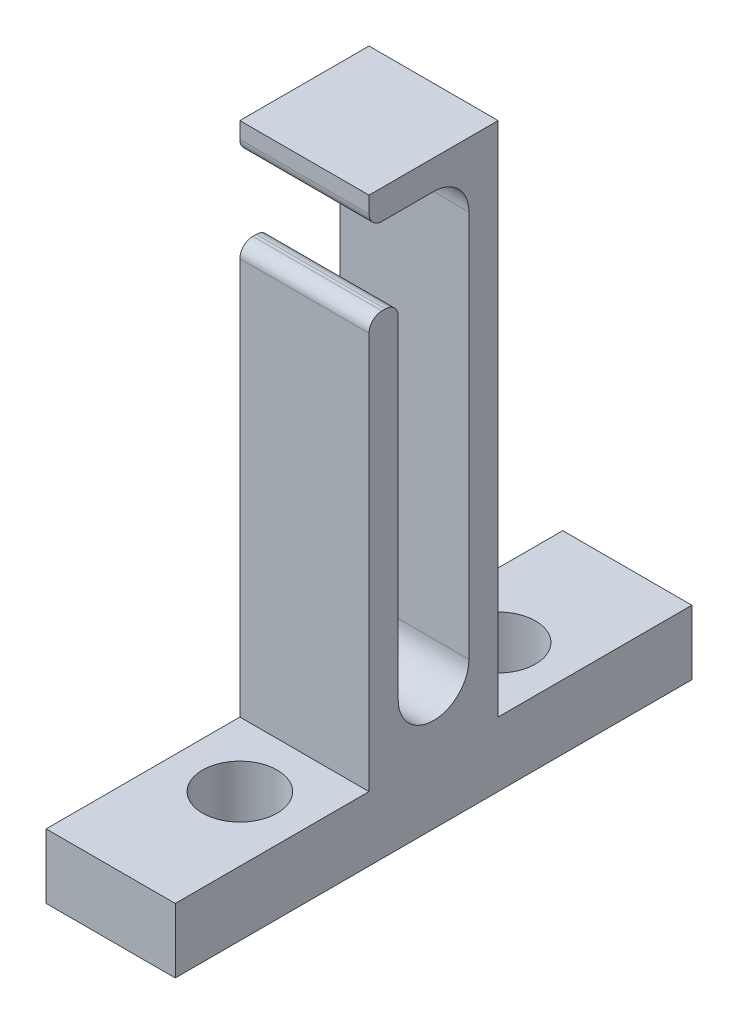
ISO-10303-21;
HEADER;
FILE_DESCRIPTION(('STEP AP214'),'2;1');
FILE_NAME('part.step','',(''),(''),'','','');
FILE_SCHEMA(('AUTOMOTIVE_DESIGN { 1 0 10303 214 1 1 1 1 }'));
ENDSEC;
DATA;
#1=APPLICATION_CONTEXT('core data for automotive mechanical design processes');
#2=APPLICATION_PROTOCOL_DEFINITION('international standard','automotive_design',2000,#1);
#3=PRODUCT_CONTEXT('',#1,'mechanical');
#4=PRODUCT('Part','Part','',(#3));
#5=PRODUCT_RELATED_PRODUCT_CATEGORY('part','',(#4));
#6=PRODUCT_DEFINITION_FORMATION('','',#4);
#7=PRODUCT_DEFINITION_CONTEXT('part definition',#1,'design');
#8=PRODUCT_DEFINITION('design','',#6,#7);
#9=PRODUCT_DEFINITION_SHAPE('','',#8);
#10=(LENGTH_UNIT() NAMED_UNIT(*) SI_UNIT(.MILLI.,.METRE.));
#11=(NAMED_UNIT(*) PLANE_ANGLE_UNIT() SI_UNIT($,.RADIAN.));
#12=(NAMED_UNIT(*) SI_UNIT($,.STERADIAN.) SOLID_ANGLE_UNIT());
#13=UNCERTAINTY_MEASURE_WITH_UNIT(LENGTH_MEASURE(1.E-05),#10,'distance_accuracy_value','');
#14=(GEOMETRIC_REPRESENTATION_CONTEXT(3) GLOBAL_UNCERTAINTY_ASSIGNED_CONTEXT((#13)) GLOBAL_UNIT_ASSIGNED_CONTEXT((#10,
#11,#12)) REPRESENTATION_CONTEXT('',''));
#15=CARTESIAN_POINT('',(0.,0.,0.));
#16=DIRECTION('',(0.,0.,1.));
#17=DIRECTION('',(1.,0.,0.));
#18=AXIS2_PLACEMENT_3D('',#15,#16,#17);
#19=CARTESIAN_POINT('',(0.,0.,12.7));
#20=DIRECTION('',(0.,0.,-1.));
#21=DIRECTION('',(-1.,0.,0.));
#22=AXIS2_PLACEMENT_3D('',#19,#20,#21);
#23=PLANE('',#22);
#24=DIRECTION('',(0.,1.,0.));
#25=VECTOR('',#24,1.);
#26=CARTESIAN_POINT('',(6.35,-25.4,12.7));
#27=LINE('',#26,#25);
#28=CARTESIAN_POINT('',(6.35,-25.4,12.7));
#29=VERTEX_POINT('',#28);
#30=CARTESIAN_POINT('',(6.35,13.634999908,12.7));
#31=VERTEX_POINT('',#30);
#32=EDGE_CURVE('E260',#29,#31,#27,.T.);
#33=ORIENTED_EDGE('',*,*,#32,.T.);
#34=DIRECTION('',(1.,0.,0.));
#35=VECTOR('',#34,1.);
#36=CARTESIAN_POINT('',(0.,13.634999908,12.7));
#37=LINE('',#36,#35);
#38=CARTESIAN_POINT('',(-6.35,13.634999908,12.7));
#39=VERTEX_POINT('',#38);
#40=EDGE_CURVE('E313',#31,#39,#37,.F.);
#41=ORIENTED_EDGE('',*,*,#40,.T.);
#42=DIRECTION('',(0.,-1.,0.));
#43=VECTOR('',#42,1.);
#44=CARTESIAN_POINT('',(-6.35,-25.4,12.7));
#45=LINE('',#44,#43);
#46=CARTESIAN_POINT('',(-6.35,-25.4,12.7));
#47=VERTEX_POINT('',#46);
#48=EDGE_CURVE('E268',#39,#47,#45,.T.);
#49=ORIENTED_EDGE('',*,*,#48,.T.);
#50=DIRECTION('',(1.,0.,0.));
#51=VECTOR('',#50,1.);
#52=CARTESIAN_POINT('',(-6.35,-25.4,12.7));
#53=LINE('',#52,#51);
#54=EDGE_CURVE('E272',#47,#29,#53,.T.);
#55=ORIENTED_EDGE('',*,*,#54,.T.);
#56=EDGE_LOOP('',(#33,#41,#49,#55));
#57=FACE_BOUND('',#56,.T.);
#58=ADVANCED_FACE('F39',(#57),#23,.F.);
#59=CARTESIAN_POINT('',(6.35,-25.4,12.7));
#60=DIRECTION('',(-1.,0.,0.));
#61=DIRECTION('',(0.,0.,1.));
#62=AXIS2_PLACEMENT_3D('',#59,#60,#61);
#63=PLANE('',#62);
#64=DIRECTION('',(0.,0.,-1.));
#65=VECTOR('',#64,1.);
#66=CARTESIAN_POINT('',(6.35,14.904999908,12.7));
#67=LINE('',#66,#65);
#68=CARTESIAN_POINT('',(6.35,14.904999908,11.43));
#69=VERTEX_POINT('',#68);
#70=CARTESIAN_POINT('',(6.35,14.904999908,11.094999908));
#71=VERTEX_POINT('',#70);
#72=EDGE_CURVE('E233',#69,#71,#67,.T.);
#73=ORIENTED_EDGE('',*,*,#72,.F.);
#74=CARTESIAN_POINT('',(6.35,13.634999908,11.43));
#75=DIRECTION('',(-1.,0.,0.));
#76=DIRECTION('',(0.,0.,1.));
#77=AXIS2_PLACEMENT_3D('',#74,#75,#76);
#78=CIRCLE('',#77,1.27);
#79=EDGE_CURVE('E310',#69,#31,#78,.F.);
#80=ORIENTED_EDGE('',*,*,#79,.T.);
#81=ORIENTED_EDGE('',*,*,#32,.F.);
#82=DIRECTION('',(0.,0.,1.));
#83=VECTOR('',#82,1.);
#84=CARTESIAN_POINT('',(6.35,-25.4,-19.05));
#85=LINE('',#84,#83);
#86=CARTESIAN_POINT('',(6.34999999999999,-25.4,31.75));
#87=VERTEX_POINT('',#86);
#88=EDGE_CURVE('E193',#29,#87,#85,.T.);
#89=ORIENTED_EDGE('',*,*,#88,.T.);
#90=DIRECTION('',(0.,1.,0.));
#91=VECTOR('',#90,1.);
#92=CARTESIAN_POINT('',(6.34999999999999,-31.75,31.75));
#93=LINE('',#92,#91);
#94=CARTESIAN_POINT('',(6.34999999999999,-31.75,31.75));
#95=VERTEX_POINT('',#94);
#96=EDGE_CURVE('E170',#95,#87,#93,.T.);
#97=ORIENTED_EDGE('',*,*,#96,.F.);
#98=DIRECTION('',(0.,0.,1.));
#99=VECTOR('',#98,1.);
#100=CARTESIAN_POINT('',(6.35,-31.75,-19.05));
#101=LINE('',#100,#99);
#102=CARTESIAN_POINT('',(6.35,-31.75,-19.05));
#103=VERTEX_POINT('',#102);
#104=EDGE_CURVE('E177',#103,#95,#101,.T.);
#105=ORIENTED_EDGE('',*,*,#104,.F.);
#106=DIRECTION('',(0.,1.,0.));
#107=VECTOR('',#106,1.);
#108=CARTESIAN_POINT('',(6.35,-31.75,-19.05));
#109=LINE('',#108,#107);
#110=CARTESIAN_POINT('',(6.35,-25.4,-19.05));
#111=VERTEX_POINT('',#110);
#112=EDGE_CURVE('E568',#103,#111,#109,.T.);
#113=ORIENTED_EDGE('',*,*,#112,.T.);
#114=CARTESIAN_POINT('',(6.35,-25.4,0.));
#115=VERTEX_POINT('',#114);
#116=EDGE_CURVE('E569',#111,#115,#85,.T.);
#117=ORIENTED_EDGE('',*,*,#116,.T.);
#118=DIRECTION('',(0.,1.,0.));
#119=VECTOR('',#118,1.);
#120=CARTESIAN_POINT('',(6.35,-25.4,0.));
#121=LINE('',#120,#119);
#122=CARTESIAN_POINT('',(6.35,25.4,0.));
#123=VERTEX_POINT('',#122);
#124=EDGE_CURVE('E250',#115,#123,#121,.T.);
#125=ORIENTED_EDGE('',*,*,#124,.T.);
#126=DIRECTION('',(0.,0.,-1.));
#127=VECTOR('',#126,1.);
#128=CARTESIAN_POINT('',(6.35,25.4,12.7));
#129=LINE('',#128,#127);
#130=CARTESIAN_POINT('',(6.35,25.4,12.7));
#131=VERTEX_POINT('',#130);
#132=EDGE_CURVE('E293',#131,#123,#129,.T.);
#133=ORIENTED_EDGE('',*,*,#132,.F.);
#134=CARTESIAN_POINT('',(6.35,23.794999908,12.7));
#135=VERTEX_POINT('',#134);
#136=EDGE_CURVE('E265',#135,#131,#27,.T.);
#137=ORIENTED_EDGE('',*,*,#136,.F.);
#138=CARTESIAN_POINT('',(6.35,23.794999908,11.43));
#139=DIRECTION('',(-1.,0.,0.));
#140=DIRECTION('',(0.,0.,1.));
#141=AXIS2_PLACEMENT_3D('',#138,#139,#140);
#142=CIRCLE('',#141,1.27);
#143=CARTESIAN_POINT('',(6.35,22.524999908,11.43));
#144=VERTEX_POINT('',#143);
#145=EDGE_CURVE('E304',#135,#144,#142,.F.);
#146=ORIENTED_EDGE('',*,*,#145,.T.);
#147=DIRECTION('',(0.,0.,1.));
#148=VECTOR('',#147,1.);
#149=CARTESIAN_POINT('',(6.35,22.524999908,9.824999908));
#150=LINE('',#149,#148);
#151=CARTESIAN_POINT('',(6.35,22.524999908,6.35000000000001));
#152=VERTEX_POINT('',#151);
#153=EDGE_CURVE('E201',#152,#144,#150,.T.);
#154=ORIENTED_EDGE('',*,*,#153,.F.);
#155=CARTESIAN_POINT('',(6.35,19.05,6.35000000000001));
#156=DIRECTION('',(1.,0.,0.));
#157=DIRECTION('',(0.,0.,-1.));
#158=AXIS2_PLACEMENT_3D('',#155,#156,#157);
#159=CIRCLE('',#158,3.474999908);
#160=CARTESIAN_POINT('',(6.35,19.05,2.875000092));
#161=VERTEX_POINT('',#160);
#162=EDGE_CURVE('E196',#161,#152,#159,.T.);
#163=ORIENTED_EDGE('',*,*,#162,.F.);
#164=DIRECTION('',(0.,1.,0.));
#165=VECTOR('',#164,1.);
#166=CARTESIAN_POINT('',(6.35,19.05,2.875000092));
#167=LINE('',#166,#165);
#168=CARTESIAN_POINT('',(6.35,-19.05,2.87500009199999));
#169=VERTEX_POINT('',#168);
#170=EDGE_CURVE('E212',#169,#161,#167,.T.);
#171=ORIENTED_EDGE('',*,*,#170,.F.);
#172=CARTESIAN_POINT('',(6.35,-19.05,6.34999999999999));
#173=DIRECTION('',(1.,0.,0.));
#174=DIRECTION('',(0.,0.,-1.));
#175=AXIS2_PLACEMENT_3D('',#172,#173,#174);
#176=CIRCLE('',#175,3.474999908);
#177=CARTESIAN_POINT('',(6.35,-19.05,9.824999908));
#178=VERTEX_POINT('',#177);
#179=EDGE_CURVE('E240',#178,#169,#176,.T.);
#180=ORIENTED_EDGE('',*,*,#179,.F.);
#181=DIRECTION('',(0.,-1.,0.));
#182=VECTOR('',#181,1.);
#183=CARTESIAN_POINT('',(6.35,14.904999908,9.824999908));
#184=LINE('',#183,#182);
#185=CARTESIAN_POINT('',(6.35,13.634999908,9.824999908));
#186=VERTEX_POINT('',#185);
#187=EDGE_CURVE('E237',#186,#178,#184,.T.);
#188=ORIENTED_EDGE('',*,*,#187,.F.);
#189=CARTESIAN_POINT('',(6.35,13.634999908,11.094999908));
#190=DIRECTION('',(-1.,0.,0.));
#191=DIRECTION('',(0.,0.,1.));
#192=AXIS2_PLACEMENT_3D('',#189,#190,#191);
#193=CIRCLE('',#192,1.27);
#194=EDGE_CURVE('E307',#186,#71,#193,.F.);
#195=ORIENTED_EDGE('',*,*,#194,.T.);
#196=EDGE_LOOP('',(#73,#80,#81,#89,#97,#105,#113,#117,#125,#133,#137,#146,#154,#163,#171,#180,
#188,#195));
#197=FACE_BOUND('',#196,.T.);
#198=ADVANCED_FACE('F191',(#197),#63,.F.);
#199=CARTESIAN_POINT('',(-6.35,25.4,12.7));
#200=DIRECTION('',(0.,-1.,0.));
#201=DIRECTION('',(0.,0.,-1.));
#202=AXIS2_PLACEMENT_3D('',#199,#200,#201);
#203=PLANE('',#202);
#204=DIRECTION('',(-1.,0.,0.));
#205=VECTOR('',#204,1.);
#206=CARTESIAN_POINT('',(-6.35,25.4,0.));
#207=LINE('',#206,#205);
#208=CARTESIAN_POINT('',(-6.35,25.4,0.));
#209=VERTEX_POINT('',#208);
#210=EDGE_CURVE('E280',#123,#209,#207,.T.);
#211=ORIENTED_EDGE('',*,*,#210,.T.);
#212=DIRECTION('',(0.,0.,-1.));
#213=VECTOR('',#212,1.);
#214=CARTESIAN_POINT('',(-6.35,25.4,12.7));
#215=LINE('',#214,#213);
#216=CARTESIAN_POINT('',(-6.35,25.4,12.7));
#217=VERTEX_POINT('',#216);
#218=EDGE_CURVE('E276',#217,#209,#215,.T.);
#219=ORIENTED_EDGE('',*,*,#218,.F.);
#220=DIRECTION('',(-1.,0.,0.));
#221=VECTOR('',#220,1.);
#222=CARTESIAN_POINT('',(-6.35,25.4,12.7));
#223=LINE('',#222,#221);
#224=EDGE_CURVE('E264',#131,#217,#223,.T.);
#225=ORIENTED_EDGE('',*,*,#224,.F.);
#226=ORIENTED_EDGE('',*,*,#132,.T.);
#227=EDGE_LOOP('',(#211,#219,#225,#226));
#228=FACE_BOUND('',#227,.T.);
#229=ADVANCED_FACE('F390',(#228),#203,.F.);
#230=CARTESIAN_POINT('',(-6.35,-25.4,12.7));
#231=DIRECTION('',(1.,0.,0.));
#232=DIRECTION('',(0.,0.,-1.));
#233=AXIS2_PLACEMENT_3D('',#230,#231,#232);
#234=PLANE('',#233);
#235=ORIENTED_EDGE('',*,*,#48,.F.);
#236=CARTESIAN_POINT('',(-6.35,13.634999908,11.43));
#237=DIRECTION('',(1.,0.,0.));
#238=DIRECTION('',(0.,0.,-1.));
#239=AXIS2_PLACEMENT_3D('',#236,#237,#238);
#240=CIRCLE('',#239,1.27);
#241=CARTESIAN_POINT('',(-6.35,14.904999908,11.43));
#242=VERTEX_POINT('',#241);
#243=EDGE_CURVE('E321',#39,#242,#240,.F.);
#244=ORIENTED_EDGE('',*,*,#243,.T.);
#245=DIRECTION('',(0.,0.,-1.));
#246=VECTOR('',#245,1.);
#247=CARTESIAN_POINT('',(-6.35,14.904999908,12.7));
#248=LINE('',#247,#246);
#249=CARTESIAN_POINT('',(-6.35,14.904999908,11.094999908));
#250=VERTEX_POINT('',#249);
#251=EDGE_CURVE('E215',#242,#250,#248,.T.);
#252=ORIENTED_EDGE('',*,*,#251,.T.);
#253=CARTESIAN_POINT('',(-6.35,13.634999908,11.094999908));
#254=DIRECTION('',(1.,0.,0.));
#255=DIRECTION('',(0.,0.,-1.));
#256=AXIS2_PLACEMENT_3D('',#253,#254,#255);
#257=CIRCLE('',#256,1.27);
#258=CARTESIAN_POINT('',(-6.35,13.634999908,9.824999908));
#259=VERTEX_POINT('',#258);
#260=EDGE_CURVE('E318',#250,#259,#257,.F.);
#261=ORIENTED_EDGE('',*,*,#260,.T.);
#262=DIRECTION('',(0.,-1.,0.));
#263=VECTOR('',#262,1.);
#264=CARTESIAN_POINT('',(-6.35,14.904999908,9.824999908));
#265=LINE('',#264,#263);
#266=CARTESIAN_POINT('',(-6.35,-19.05,9.824999908));
#267=VERTEX_POINT('',#266);
#268=EDGE_CURVE('E219',#259,#267,#265,.T.);
#269=ORIENTED_EDGE('',*,*,#268,.T.);
#270=CARTESIAN_POINT('',(-6.35,-19.05,6.34999999999999));
#271=DIRECTION('',(1.,0.,0.));
#272=DIRECTION('',(0.,0.,-1.));
#273=AXIS2_PLACEMENT_3D('',#270,#271,#272);
#274=CIRCLE('',#273,3.474999908);
#275=CARTESIAN_POINT('',(-6.35,-19.05,2.87500009199999));
#276=VERTEX_POINT('',#275);
#277=EDGE_CURVE('E222',#267,#276,#274,.T.);
#278=ORIENTED_EDGE('',*,*,#277,.T.);
#279=DIRECTION('',(0.,1.,0.));
#280=VECTOR('',#279,1.);
#281=CARTESIAN_POINT('',(-6.35,19.05,2.875000092));
#282=LINE('',#281,#280);
#283=CARTESIAN_POINT('',(-6.35,19.05,2.875000092));
#284=VERTEX_POINT('',#283);
#285=EDGE_CURVE('E226',#276,#284,#282,.T.);
#286=ORIENTED_EDGE('',*,*,#285,.T.);
#287=CARTESIAN_POINT('',(-6.35,19.05,6.35000000000001));
#288=DIRECTION('',(1.,0.,0.));
#289=DIRECTION('',(0.,0.,-1.));
#290=AXIS2_PLACEMENT_3D('',#287,#288,#289);
#291=CIRCLE('',#290,3.474999908);
#292=CARTESIAN_POINT('',(-6.35,22.524999908,6.35000000000001));
#293=VERTEX_POINT('',#292);
#294=EDGE_CURVE('E207',#284,#293,#291,.T.);
#295=ORIENTED_EDGE('',*,*,#294,.T.);
#296=DIRECTION('',(0.,0.,1.));
#297=VECTOR('',#296,1.);
#298=CARTESIAN_POINT('',(-6.35,22.524999908,9.824999908));
#299=LINE('',#298,#297);
#300=CARTESIAN_POINT('',(-6.35,22.524999908,11.43));
#301=VERTEX_POINT('',#300);
#302=EDGE_CURVE('E211',#293,#301,#299,.T.);
#303=ORIENTED_EDGE('',*,*,#302,.T.);
#304=CARTESIAN_POINT('',(-6.35,23.794999908,11.43));
#305=DIRECTION('',(1.,0.,0.));
#306=DIRECTION('',(0.,0.,-1.));
#307=AXIS2_PLACEMENT_3D('',#304,#305,#306);
#308=CIRCLE('',#307,1.27);
#309=CARTESIAN_POINT('',(-6.35,23.794999908,12.7));
#310=VERTEX_POINT('',#309);
#311=EDGE_CURVE('E55',#301,#310,#308,.F.);
#312=ORIENTED_EDGE('',*,*,#311,.T.);
#313=EDGE_CURVE('E269',#217,#310,#45,.T.);
#314=ORIENTED_EDGE('',*,*,#313,.F.);
#315=ORIENTED_EDGE('',*,*,#218,.T.);
#316=DIRECTION('',(0.,-1.,0.));
#317=VECTOR('',#316,1.);
#318=CARTESIAN_POINT('',(-6.35,-25.4,0.));
#319=LINE('',#318,#317);
#320=CARTESIAN_POINT('',(-6.35,-25.4,0.));
#321=VERTEX_POINT('',#320);
#322=EDGE_CURVE('E283',#209,#321,#319,.T.);
#323=ORIENTED_EDGE('',*,*,#322,.T.);
#324=DIRECTION('',(0.,0.,-1.));
#325=VECTOR('',#324,1.);
#326=CARTESIAN_POINT('',(-6.35,-25.4,-19.05));
#327=LINE('',#326,#325);
#328=CARTESIAN_POINT('',(-6.35,-25.4,-19.05));
#329=VERTEX_POINT('',#328);
#330=EDGE_CURVE('E576',#321,#329,#327,.T.);
#331=ORIENTED_EDGE('',*,*,#330,.T.);
#332=DIRECTION('',(0.,1.,0.));
#333=VECTOR('',#332,1.);
#334=CARTESIAN_POINT('',(-6.35,-31.75,-19.05));
#335=LINE('',#334,#333);
#336=CARTESIAN_POINT('',(-6.35,-31.75,-19.05));
#337=VERTEX_POINT('',#336);
#338=EDGE_CURVE('E203',#337,#329,#335,.T.);
#339=ORIENTED_EDGE('',*,*,#338,.F.);
#340=DIRECTION('',(0.,0.,-1.));
#341=VECTOR('',#340,1.);
#342=CARTESIAN_POINT('',(-6.35,-31.75,-19.05));
#343=LINE('',#342,#341);
#344=CARTESIAN_POINT('',(-6.35000000000001,-31.75,31.75));
#345=VERTEX_POINT('',#344);
#346=EDGE_CURVE('E176',#345,#337,#343,.T.);
#347=ORIENTED_EDGE('',*,*,#346,.F.);
#348=DIRECTION('',(0.,1.,0.));
#349=VECTOR('',#348,1.);
#350=CARTESIAN_POINT('',(-6.35000000000001,-31.75,31.75));
#351=LINE('',#350,#349);
#352=CARTESIAN_POINT('',(-6.35000000000001,-25.4,31.75));
#353=VERTEX_POINT('',#352);
#354=EDGE_CURVE('E172',#345,#353,#351,.T.);
#355=ORIENTED_EDGE('',*,*,#354,.T.);
#356=EDGE_CURVE('E348',#353,#47,#327,.T.);
#357=ORIENTED_EDGE('',*,*,#356,.T.);
#358=EDGE_LOOP('',(#235,#244,#252,#261,#269,#278,#286,#295,#303,#312,#314,#315,#323,#331,#339,
#347,#355,#357));
#359=FACE_BOUND('',#358,.T.);
#360=ADVANCED_FACE('F345',(#359),#234,.F.);
#361=ORIENTED_EDGE('',*,*,#313,.T.);
#362=DIRECTION('',(1.,0.,0.));
#363=VECTOR('',#362,1.);
#364=CARTESIAN_POINT('',(0.,23.794999908,12.7));
#365=LINE('',#364,#363);
#366=EDGE_CURVE('E48',#310,#135,#365,.T.);
#367=ORIENTED_EDGE('',*,*,#366,.T.);
#368=ORIENTED_EDGE('',*,*,#136,.T.);
#369=ORIENTED_EDGE('',*,*,#224,.T.);
#370=EDGE_LOOP('',(#361,#367,#368,#369));
#371=FACE_BOUND('',#370,.T.);
#372=ADVANCED_FACE('F332',(#371),#23,.F.);
#373=CARTESIAN_POINT('',(0.,0.,0.));
#374=DIRECTION('',(0.,0.,-1.));
#375=DIRECTION('',(-1.,0.,0.));
#376=AXIS2_PLACEMENT_3D('',#373,#374,#375);
#377=PLANE('',#376);
#378=ORIENTED_EDGE('',*,*,#124,.F.);
#379=DIRECTION('',(1.,0.,0.));
#380=VECTOR('',#379,1.);
#381=CARTESIAN_POINT('',(-6.35,-25.4,0.));
#382=LINE('',#381,#380);
#383=EDGE_CURVE('E287',#321,#115,#382,.T.);
#384=ORIENTED_EDGE('',*,*,#383,.F.);
#385=ORIENTED_EDGE('',*,*,#322,.F.);
#386=ORIENTED_EDGE('',*,*,#210,.F.);
#387=EDGE_LOOP('',(#378,#384,#385,#386));
#388=FACE_BOUND('',#387,.T.);
#389=ADVANCED_FACE('F395',(#388),#377,.T.);
#390=CARTESIAN_POINT('',(-6.35,19.05,6.35000000000001));
#391=DIRECTION('',(1.,0.,0.));
#392=DIRECTION('',(0.,0.,-1.));
#393=AXIS2_PLACEMENT_3D('',#390,#391,#392);
#394=CYLINDRICAL_SURFACE('',#393,3.474999908);
#395=ORIENTED_EDGE('',*,*,#162,.T.);
#396=DIRECTION('',(1.,0.,0.));
#397=VECTOR('',#396,1.);
#398=CARTESIAN_POINT('',(-6.35,22.524999908,6.35000000000001));
#399=LINE('',#398,#397);
#400=EDGE_CURVE('E229',#293,#152,#399,.T.);
#401=ORIENTED_EDGE('',*,*,#400,.F.);
#402=ORIENTED_EDGE('',*,*,#294,.F.);
#403=DIRECTION('',(1.,0.,0.));
#404=VECTOR('',#403,1.);
#405=CARTESIAN_POINT('',(-6.35,19.05,2.875000092));
#406=LINE('',#405,#404);
#407=EDGE_CURVE('E247',#284,#161,#406,.T.);
#408=ORIENTED_EDGE('',*,*,#407,.T.);
#409=EDGE_LOOP('',(#395,#401,#402,#408));
#410=FACE_BOUND('',#409,.T.);
#411=ADVANCED_FACE('F375',(#410),#394,.F.);
#412=CARTESIAN_POINT('',(-6.35,19.05,2.875000092));
#413=DIRECTION('',(0.,0.,-1.));
#414=DIRECTION('',(0.,1.,0.));
#415=AXIS2_PLACEMENT_3D('',#412,#413,#414);
#416=PLANE('',#415);
#417=ORIENTED_EDGE('',*,*,#170,.T.);
#418=ORIENTED_EDGE('',*,*,#407,.F.);
#419=ORIENTED_EDGE('',*,*,#285,.F.);
#420=DIRECTION('',(1.,0.,0.));
#421=VECTOR('',#420,1.);
#422=CARTESIAN_POINT('',(-6.35,-19.05,2.87500009199999));
#423=LINE('',#422,#421);
#424=EDGE_CURVE('E251',#276,#169,#423,.T.);
#425=ORIENTED_EDGE('',*,*,#424,.T.);
#426=EDGE_LOOP('',(#417,#418,#419,#425));
#427=FACE_BOUND('',#426,.T.);
#428=ADVANCED_FACE('F371',(#427),#416,.F.);
#429=CARTESIAN_POINT('',(-6.35,-19.05,6.34999999999999));
#430=DIRECTION('',(1.,0.,0.));
#431=DIRECTION('',(0.,0.,-1.));
#432=AXIS2_PLACEMENT_3D('',#429,#430,#431);
#433=CYLINDRICAL_SURFACE('',#432,3.474999908);
#434=ORIENTED_EDGE('',*,*,#179,.T.);
#435=ORIENTED_EDGE('',*,*,#424,.F.);
#436=ORIENTED_EDGE('',*,*,#277,.F.);
#437=DIRECTION('',(1.,0.,0.));
#438=VECTOR('',#437,1.);
#439=CARTESIAN_POINT('',(-6.35,-19.05,9.824999908));
#440=LINE('',#439,#438);
#441=EDGE_CURVE('E254',#267,#178,#440,.T.);
#442=ORIENTED_EDGE('',*,*,#441,.T.);
#443=EDGE_LOOP('',(#434,#435,#436,#442));
#444=FACE_BOUND('',#443,.T.);
#445=ADVANCED_FACE('F368',(#444),#433,.F.);
#446=CARTESIAN_POINT('',(-6.35,14.904999908,9.824999908));
#447=DIRECTION('',(0.,0.,1.));
#448=DIRECTION('',(0.,-1.,0.));
#449=AXIS2_PLACEMENT_3D('',#446,#447,#448);
#450=PLANE('',#449);
#451=ORIENTED_EDGE('',*,*,#268,.F.);
#452=DIRECTION('',(1.,0.,0.));
#453=VECTOR('',#452,1.);
#454=CARTESIAN_POINT('',(-6.35,13.634999908,9.824999908));
#455=LINE('',#454,#453);
#456=EDGE_CURVE('E324',#259,#186,#455,.T.);
#457=ORIENTED_EDGE('',*,*,#456,.T.);
#458=ORIENTED_EDGE('',*,*,#187,.T.);
#459=ORIENTED_EDGE('',*,*,#441,.F.);
#460=EDGE_LOOP('',(#451,#457,#458,#459));
#461=FACE_BOUND('',#460,.T.);
#462=ADVANCED_FACE('F363',(#461),#450,.F.);
#463=CARTESIAN_POINT('',(-6.35,14.904999908,12.7));
#464=DIRECTION('',(0.,-1.,0.));
#465=DIRECTION('',(0.,0.,-1.));
#466=AXIS2_PLACEMENT_3D('',#463,#464,#465);
#467=PLANE('',#466);
#468=ORIENTED_EDGE('',*,*,#251,.F.);
#469=DIRECTION('',(1.,0.,0.));
#470=VECTOR('',#469,1.);
#471=CARTESIAN_POINT('',(-6.35,14.904999908,11.43));
#472=LINE('',#471,#470);
#473=EDGE_CURVE('E300',#242,#69,#472,.T.);
#474=ORIENTED_EDGE('',*,*,#473,.T.);
#475=ORIENTED_EDGE('',*,*,#72,.T.);
#476=DIRECTION('',(1.,0.,0.));
#477=VECTOR('',#476,1.);
#478=CARTESIAN_POINT('',(-6.35,14.904999908,11.094999908));
#479=LINE('',#478,#477);
#480=EDGE_CURVE('E297',#71,#250,#479,.F.);
#481=ORIENTED_EDGE('',*,*,#480,.T.);
#482=EDGE_LOOP('',(#468,#474,#475,#481));
#483=FACE_BOUND('',#482,.T.);
#484=ADVANCED_FACE('F353',(#483),#467,.F.);
#485=CARTESIAN_POINT('',(-6.35,22.524999908,9.824999908));
#486=DIRECTION('',(0.,1.,0.));
#487=DIRECTION('',(0.,0.,1.));
#488=AXIS2_PLACEMENT_3D('',#485,#486,#487);
#489=PLANE('',#488);
#490=ORIENTED_EDGE('',*,*,#153,.T.);
#491=DIRECTION('',(1.,0.,0.));
#492=VECTOR('',#491,1.);
#493=CARTESIAN_POINT('',(-6.35,22.524999908,11.43));
#494=LINE('',#493,#492);
#495=EDGE_CURVE('E11',#144,#301,#494,.F.);
#496=ORIENTED_EDGE('',*,*,#495,.T.);
#497=ORIENTED_EDGE('',*,*,#302,.F.);
#498=ORIENTED_EDGE('',*,*,#400,.T.);
#499=EDGE_LOOP('',(#490,#496,#497,#498));
#500=FACE_BOUND('',#499,.T.);
#501=ADVANCED_FACE('F409',(#500),#489,.F.);
#502=CARTESIAN_POINT('',(-6.35,13.634999908,11.43));
#503=DIRECTION('',(1.,0.,0.));
#504=DIRECTION('',(0.,0.,-1.));
#505=AXIS2_PLACEMENT_3D('',#502,#503,#504);
#506=CYLINDRICAL_SURFACE('',#505,1.27);
#507=ORIENTED_EDGE('',*,*,#243,.F.);
#508=ORIENTED_EDGE('',*,*,#40,.F.);
#509=ORIENTED_EDGE('',*,*,#79,.F.);
#510=ORIENTED_EDGE('',*,*,#473,.F.);
#511=EDGE_LOOP('',(#507,#508,#509,#510));
#512=FACE_BOUND('',#511,.T.);
#513=ADVANCED_FACE('F351',(#512),#506,.T.);
#514=CARTESIAN_POINT('',(-6.35,13.634999908,11.094999908));
#515=DIRECTION('',(1.,0.,0.));
#516=DIRECTION('',(0.,0.,-1.));
#517=AXIS2_PLACEMENT_3D('',#514,#515,#516);
#518=CYLINDRICAL_SURFACE('',#517,1.27);
#519=ORIENTED_EDGE('',*,*,#260,.F.);
#520=ORIENTED_EDGE('',*,*,#480,.F.);
#521=ORIENTED_EDGE('',*,*,#194,.F.);
#522=ORIENTED_EDGE('',*,*,#456,.F.);
#523=EDGE_LOOP('',(#519,#520,#521,#522));
#524=FACE_BOUND('',#523,.T.);
#525=ADVANCED_FACE('F360',(#524),#518,.T.);
#526=CARTESIAN_POINT('',(0.,23.794999908,11.43));
#527=DIRECTION('',(1.,0.,0.));
#528=DIRECTION('',(0.,0.,-1.));
#529=AXIS2_PLACEMENT_3D('',#526,#527,#528);
#530=CYLINDRICAL_SURFACE('',#529,1.27);
#531=ORIENTED_EDGE('',*,*,#311,.F.);
#532=ORIENTED_EDGE('',*,*,#495,.F.);
#533=ORIENTED_EDGE('',*,*,#145,.F.);
#534=ORIENTED_EDGE('',*,*,#366,.F.);
#535=EDGE_LOOP('',(#531,#532,#533,#534));
#536=FACE_BOUND('',#535,.T.);
#537=ADVANCED_FACE('F41',(#536),#530,.T.);
#538=CARTESIAN_POINT('',(0.,-25.4,0.));
#539=DIRECTION('',(0.,1.,0.));
#540=DIRECTION('',(0.,0.,1.));
#541=AXIS2_PLACEMENT_3D('',#538,#539,#540);
#542=PLANE('',#541);
#543=CARTESIAN_POINT('',(0.,-25.4,19.05));
#544=DIRECTION('',(0.,-1.,0.));
#545=DIRECTION('',(0.,0.,-1.));
#546=AXIS2_PLACEMENT_3D('',#543,#544,#545);
#547=CIRCLE('',#546,3.675);
#548=CARTESIAN_POINT('',(0.,-25.4,15.375));
#549=VERTEX_POINT('',#548);
#550=EDGE_CURVE('E550',#549,#549,#547,.T.);
#551=ORIENTED_EDGE('',*,*,#550,.T.);
#552=EDGE_LOOP('',(#551));
#553=FACE_BOUND('',#552,.T.);
#554=ORIENTED_EDGE('',*,*,#54,.F.);
#555=ORIENTED_EDGE('',*,*,#356,.F.);
#556=DIRECTION('',(-1.,0.,0.));
#557=VECTOR('',#556,1.);
#558=CARTESIAN_POINT('',(-6.35000000000001,-25.4,31.75));
#559=LINE('',#558,#557);
#560=EDGE_CURVE('E573',#87,#353,#559,.T.);
#561=ORIENTED_EDGE('',*,*,#560,.F.);
#562=ORIENTED_EDGE('',*,*,#88,.F.);
#563=EDGE_LOOP('',(#554,#555,#561,#562));
#564=FACE_BOUND('',#563,.T.);
#565=ADVANCED_FACE('F377',(#553,#564),#542,.T.);
#566=CARTESIAN_POINT('',(0.,-31.75,0.));
#567=DIRECTION('',(0.,1.,0.));
#568=DIRECTION('',(0.,0.,1.));
#569=AXIS2_PLACEMENT_3D('',#566,#567,#568);
#570=PLANE('',#569);
#571=ORIENTED_EDGE('',*,*,#104,.T.);
#572=DIRECTION('',(-1.,0.,0.));
#573=VECTOR('',#572,1.);
#574=CARTESIAN_POINT('',(-6.35000000000001,-31.75,31.75));
#575=LINE('',#574,#573);
#576=EDGE_CURVE('E166',#95,#345,#575,.T.);
#577=ORIENTED_EDGE('',*,*,#576,.T.);
#578=ORIENTED_EDGE('',*,*,#346,.T.);
#579=DIRECTION('',(1.,0.,0.));
#580=VECTOR('',#579,1.);
#581=CARTESIAN_POINT('',(-6.35,-31.75,-19.05));
#582=LINE('',#581,#580);
#583=EDGE_CURVE('E183',#337,#103,#582,.T.);
#584=ORIENTED_EDGE('',*,*,#583,.T.);
#585=EDGE_LOOP('',(#571,#577,#578,#584));
#586=FACE_BOUND('',#585,.T.);
#587=CARTESIAN_POINT('',(0.,-31.75,-6.35));
#588=DIRECTION('',(0.,-1.,0.));
#589=DIRECTION('',(0.,0.,-1.));
#590=AXIS2_PLACEMENT_3D('',#587,#588,#589);
#591=CIRCLE('',#590,3.675);
#592=CARTESIAN_POINT('',(0.,-31.75,-10.025));
#593=VERTEX_POINT('',#592);
#594=EDGE_CURVE('E557',#593,#593,#591,.T.);
#595=ORIENTED_EDGE('',*,*,#594,.F.);
#596=EDGE_LOOP('',(#595));
#597=FACE_BOUND('',#596,.T.);
#598=CARTESIAN_POINT('',(0.,-31.75,19.05));
#599=DIRECTION('',(0.,-1.,0.));
#600=DIRECTION('',(0.,0.,-1.));
#601=AXIS2_PLACEMENT_3D('',#598,#599,#600);
#602=CIRCLE('',#601,3.675);
#603=CARTESIAN_POINT('',(0.,-31.75,15.375));
#604=VERTEX_POINT('',#603);
#605=EDGE_CURVE('E547',#604,#604,#602,.T.);
#606=ORIENTED_EDGE('',*,*,#605,.F.);
#607=EDGE_LOOP('',(#606));
#608=FACE_BOUND('',#607,.T.);
#609=ADVANCED_FACE('F180',(#586,#597,#608),#570,.F.);
#610=CARTESIAN_POINT('',(0.,-25.4,-6.35));
#611=DIRECTION('',(0.,-1.,0.));
#612=DIRECTION('',(0.,0.,-1.));
#613=AXIS2_PLACEMENT_3D('',#610,#611,#612);
#614=CIRCLE('',#613,3.675);
#615=CARTESIAN_POINT('',(0.,-25.4,-10.025));
#616=VERTEX_POINT('',#615);
#617=EDGE_CURVE('E554',#616,#616,#614,.T.);
#618=ORIENTED_EDGE('',*,*,#617,.T.);
#619=EDGE_LOOP('',(#618));
#620=FACE_BOUND('',#619,.T.);
#621=ORIENTED_EDGE('',*,*,#330,.F.);
#622=ORIENTED_EDGE('',*,*,#383,.T.);
#623=ORIENTED_EDGE('',*,*,#116,.F.);
#624=DIRECTION('',(1.,0.,0.));
#625=VECTOR('',#624,1.);
#626=CARTESIAN_POINT('',(-6.35,-25.4,-19.05));
#627=LINE('',#626,#625);
#628=EDGE_CURVE('E188',#329,#111,#627,.T.);
#629=ORIENTED_EDGE('',*,*,#628,.F.);
#630=EDGE_LOOP('',(#621,#622,#623,#629));
#631=FACE_BOUND('',#630,.T.);
#632=ADVANCED_FACE('F384',(#620,#631),#542,.T.);
#633=CARTESIAN_POINT('',(-6.35000000000001,-31.75,31.75));
#634=DIRECTION('',(0.,0.,-1.));
#635=DIRECTION('',(-1.,0.,0.));
#636=AXIS2_PLACEMENT_3D('',#633,#634,#635);
#637=PLANE('',#636);
#638=ORIENTED_EDGE('',*,*,#560,.T.);
#639=ORIENTED_EDGE('',*,*,#354,.F.);
#640=ORIENTED_EDGE('',*,*,#576,.F.);
#641=ORIENTED_EDGE('',*,*,#96,.T.);
#642=EDGE_LOOP('',(#638,#639,#640,#641));
#643=FACE_BOUND('',#642,.T.);
#644=ADVANCED_FACE('F168',(#643),#637,.F.);
#645=CARTESIAN_POINT('',(-6.35,-31.75,-19.05));
#646=DIRECTION('',(0.,0.,1.));
#647=DIRECTION('',(1.,0.,0.));
#648=AXIS2_PLACEMENT_3D('',#645,#646,#647);
#649=PLANE('',#648);
#650=ORIENTED_EDGE('',*,*,#628,.T.);
#651=ORIENTED_EDGE('',*,*,#112,.F.);
#652=ORIENTED_EDGE('',*,*,#583,.F.);
#653=ORIENTED_EDGE('',*,*,#338,.T.);
#654=EDGE_LOOP('',(#650,#651,#652,#653));
#655=FACE_BOUND('',#654,.T.);
#656=ADVANCED_FACE('F513',(#655),#649,.F.);
#657=CARTESIAN_POINT('',(0.,-31.75,-6.35));
#658=DIRECTION('',(0.,1.,0.));
#659=DIRECTION('',(0.,0.,1.));
#660=AXIS2_PLACEMENT_3D('',#657,#658,#659);
#661=CYLINDRICAL_SURFACE('',#660,3.675);
#662=ORIENTED_EDGE('',*,*,#594,.T.);
#663=EDGE_LOOP('',(#662));
#664=FACE_BOUND('',#663,.T.);
#665=ORIENTED_EDGE('',*,*,#617,.F.);
#666=EDGE_LOOP('',(#665));
#667=FACE_BOUND('',#666,.T.);
#668=ADVANCED_FACE('F521',(#664,#667),#661,.F.);
#669=CARTESIAN_POINT('',(0.,-31.75,19.05));
#670=DIRECTION('',(0.,1.,0.));
#671=DIRECTION('',(0.,0.,1.));
#672=AXIS2_PLACEMENT_3D('',#669,#670,#671);
#673=CYLINDRICAL_SURFACE('',#672,3.675);
#674=ORIENTED_EDGE('',*,*,#605,.T.);
#675=EDGE_LOOP('',(#674));
#676=FACE_BOUND('',#675,.T.);
#677=ORIENTED_EDGE('',*,*,#550,.F.);
#678=EDGE_LOOP('',(#677));
#679=FACE_BOUND('',#678,.T.);
#680=ADVANCED_FACE('F530',(#676,#679),#673,.F.);
#681=CLOSED_SHELL('',(#58,#198,#229,#360,#372,#389,#411,#428,#445,#462,#484,#501,#513,#525,#537,
#565,#609,#632,#644,#656,#668,#680));
#682=MANIFOLD_SOLID_BREP('B2',#681);
#683=ADVANCED_BREP_SHAPE_REPRESENTATION('',(#18,#682),#14);
#684=SHAPE_DEFINITION_REPRESENTATION(#9,#683);
ENDSEC;
END-ISO-10303-21;
